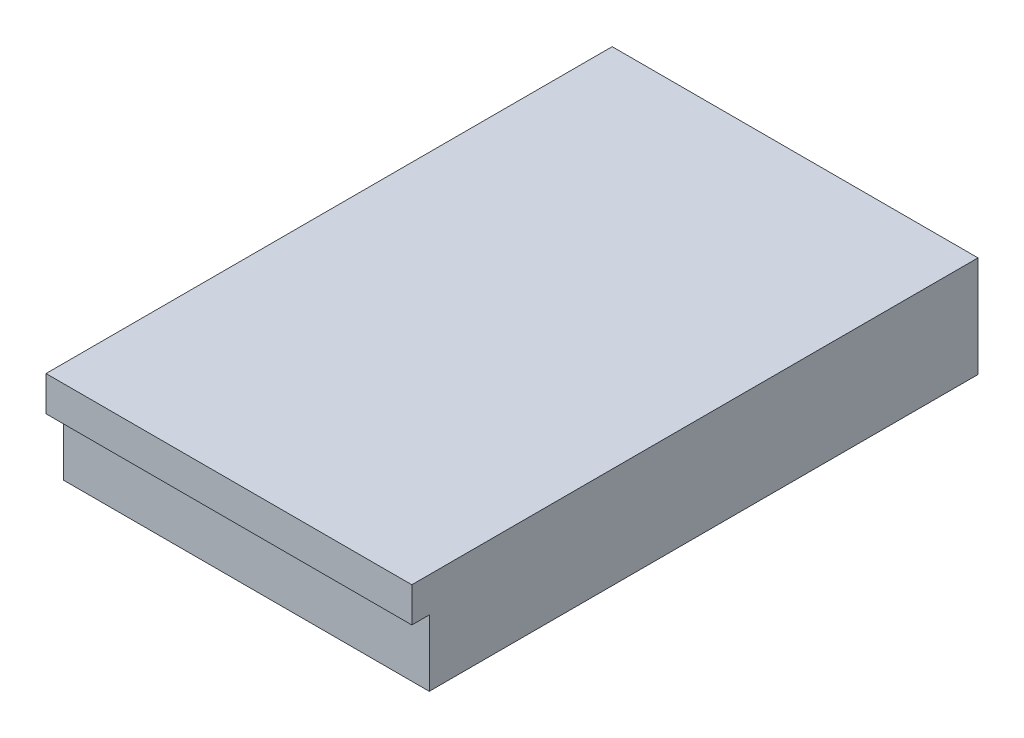
ISO-10303-21;
HEADER;
FILE_DESCRIPTION(('STEP AP214'),'2;1');
FILE_NAME('part.step','',(''),(''),'','','');
FILE_SCHEMA(('AUTOMOTIVE_DESIGN { 1 0 10303 214 1 1 1 1 }'));
ENDSEC;
DATA;
#1=APPLICATION_CONTEXT('core data for automotive mechanical design processes');
#2=APPLICATION_PROTOCOL_DEFINITION('international standard','automotive_design',2000,#1);
#3=PRODUCT_CONTEXT('',#1,'mechanical');
#4=PRODUCT('Part','Part','',(#3));
#5=PRODUCT_RELATED_PRODUCT_CATEGORY('part','',(#4));
#6=PRODUCT_DEFINITION_FORMATION('','',#4);
#7=PRODUCT_DEFINITION_CONTEXT('part definition',#1,'design');
#8=PRODUCT_DEFINITION('design','',#6,#7);
#9=PRODUCT_DEFINITION_SHAPE('','',#8);
#10=(LENGTH_UNIT() NAMED_UNIT(*) SI_UNIT(.MILLI.,.METRE.));
#11=(NAMED_UNIT(*) PLANE_ANGLE_UNIT() SI_UNIT($,.RADIAN.));
#12=(NAMED_UNIT(*) SI_UNIT($,.STERADIAN.) SOLID_ANGLE_UNIT());
#13=UNCERTAINTY_MEASURE_WITH_UNIT(LENGTH_MEASURE(1.E-05),#10,'distance_accuracy_value','');
#14=(GEOMETRIC_REPRESENTATION_CONTEXT(3) GLOBAL_UNCERTAINTY_ASSIGNED_CONTEXT((#13)) GLOBAL_UNIT_ASSIGNED_CONTEXT((#10,
#11,#12)) REPRESENTATION_CONTEXT('',''));
#15=CARTESIAN_POINT('',(0.,0.,0.));
#16=DIRECTION('',(0.,0.,1.));
#17=DIRECTION('',(1.,0.,0.));
#18=AXIS2_PLACEMENT_3D('',#15,#16,#17);
#19=CARTESIAN_POINT('',(26.67,14.732,40.005));
#20=DIRECTION('',(0.,0.,-1.));
#21=DIRECTION('',(-1.,0.,0.));
#22=AXIS2_PLACEMENT_3D('',#19,#20,#21);
#23=PLANE('',#22);
#24=DIRECTION('',(1.,0.,0.));
#25=VECTOR('',#24,1.);
#26=CARTESIAN_POINT('',(-26.67,9.652,40.005));
#27=LINE('',#26,#25);
#28=CARTESIAN_POINT('',(-26.67,9.652,40.005));
#29=VERTEX_POINT('',#28);
#30=CARTESIAN_POINT('',(26.67,9.652,40.005));
#31=VERTEX_POINT('',#30);
#32=EDGE_CURVE('E51',#29,#31,#27,.T.);
#33=ORIENTED_EDGE('',*,*,#32,.F.);
#34=DIRECTION('',(0.,-1.,0.));
#35=VECTOR('',#34,1.);
#36=CARTESIAN_POINT('',(-26.67,14.732,40.005));
#37=LINE('',#36,#35);
#38=CARTESIAN_POINT('',(-26.67,0.,40.005));
#39=VERTEX_POINT('',#38);
#40=EDGE_CURVE('E11',#29,#39,#37,.T.);
#41=ORIENTED_EDGE('',*,*,#40,.T.);
#42=DIRECTION('',(1.,0.,0.));
#43=VECTOR('',#42,1.);
#44=CARTESIAN_POINT('',(26.67,0.,40.005));
#45=LINE('',#44,#43);
#46=CARTESIAN_POINT('',(26.67,0.,40.005));
#47=VERTEX_POINT('',#46);
#48=EDGE_CURVE('E99',#39,#47,#45,.T.);
#49=ORIENTED_EDGE('',*,*,#48,.T.);
#50=DIRECTION('',(0.,-1.,0.));
#51=VECTOR('',#50,1.);
#52=CARTESIAN_POINT('',(26.67,14.732,40.005));
#53=LINE('',#52,#51);
#54=EDGE_CURVE('E44',#31,#47,#53,.T.);
#55=ORIENTED_EDGE('',*,*,#54,.F.);
#56=EDGE_LOOP('',(#33,#41,#49,#55));
#57=FACE_BOUND('',#56,.T.);
#58=ADVANCED_FACE('F35',(#57),#23,.F.);
#59=CARTESIAN_POINT('',(-26.67,14.732,-40.005));
#60=DIRECTION('',(1.,0.,0.));
#61=DIRECTION('',(0.,0.,-1.));
#62=AXIS2_PLACEMENT_3D('',#59,#60,#61);
#63=PLANE('',#62);
#64=DIRECTION('',(0.,0.,1.));
#65=VECTOR('',#64,1.);
#66=CARTESIAN_POINT('',(-26.67,0.,-40.005));
#67=LINE('',#66,#65);
#68=CARTESIAN_POINT('',(-26.67,0.,-40.005));
#69=VERTEX_POINT('',#68);
#70=EDGE_CURVE('E93',#69,#39,#67,.T.);
#71=ORIENTED_EDGE('',*,*,#70,.T.);
#72=ORIENTED_EDGE('',*,*,#40,.F.);
#73=DIRECTION('',(0.,0.,-1.));
#74=VECTOR('',#73,1.);
#75=CARTESIAN_POINT('',(-26.67,9.652,42.545));
#76=LINE('',#75,#74);
#77=CARTESIAN_POINT('',(-26.67,9.652,42.545));
#78=VERTEX_POINT('',#77);
#79=EDGE_CURVE('E100',#78,#29,#76,.T.);
#80=ORIENTED_EDGE('',*,*,#79,.F.);
#81=DIRECTION('',(0.,-1.,0.));
#82=VECTOR('',#81,1.);
#83=CARTESIAN_POINT('',(-26.67,14.732,42.545));
#84=LINE('',#83,#82);
#85=CARTESIAN_POINT('',(-26.67,14.732,42.545));
#86=VERTEX_POINT('',#85);
#87=EDGE_CURVE('E117',#86,#78,#84,.T.);
#88=ORIENTED_EDGE('',*,*,#87,.F.);
#89=DIRECTION('',(0.,0.,1.));
#90=VECTOR('',#89,1.);
#91=CARTESIAN_POINT('',(-26.67,14.732,-40.005));
#92=LINE('',#91,#90);
#93=CARTESIAN_POINT('',(-26.67,14.732,-40.005));
#94=VERTEX_POINT('',#93);
#95=EDGE_CURVE('E88',#94,#86,#92,.T.);
#96=ORIENTED_EDGE('',*,*,#95,.F.);
#97=DIRECTION('',(0.,-1.,0.));
#98=VECTOR('',#97,1.);
#99=CARTESIAN_POINT('',(-26.67,14.732,-40.005));
#100=LINE('',#99,#98);
#101=EDGE_CURVE('E81',#94,#69,#100,.T.);
#102=ORIENTED_EDGE('',*,*,#101,.T.);
#103=EDGE_LOOP('',(#71,#72,#80,#88,#96,#102));
#104=FACE_BOUND('',#103,.T.);
#105=ADVANCED_FACE('F37',(#104),#63,.F.);
#106=CARTESIAN_POINT('',(26.67,14.732,-40.005));
#107=DIRECTION('',(-1.,0.,0.));
#108=DIRECTION('',(0.,0.,1.));
#109=AXIS2_PLACEMENT_3D('',#106,#107,#108);
#110=PLANE('',#109);
#111=DIRECTION('',(0.,0.,-1.));
#112=VECTOR('',#111,1.);
#113=CARTESIAN_POINT('',(26.67,0.,-40.005));
#114=LINE('',#113,#112);
#115=CARTESIAN_POINT('',(26.67,0.,-40.005));
#116=VERTEX_POINT('',#115);
#117=EDGE_CURVE('E89',#47,#116,#114,.T.);
#118=ORIENTED_EDGE('',*,*,#117,.T.);
#119=DIRECTION('',(0.,-1.,0.));
#120=VECTOR('',#119,1.);
#121=CARTESIAN_POINT('',(26.67,14.732,-40.005));
#122=LINE('',#121,#120);
#123=CARTESIAN_POINT('',(26.67,14.732,-40.005));
#124=VERTEX_POINT('',#123);
#125=EDGE_CURVE('E84',#124,#116,#122,.T.);
#126=ORIENTED_EDGE('',*,*,#125,.F.);
#127=DIRECTION('',(0.,0.,-1.));
#128=VECTOR('',#127,1.);
#129=CARTESIAN_POINT('',(26.67,14.732,-40.005));
#130=LINE('',#129,#128);
#131=CARTESIAN_POINT('',(26.67,14.732,42.545));
#132=VERTEX_POINT('',#131);
#133=EDGE_CURVE('E124',#132,#124,#130,.T.);
#134=ORIENTED_EDGE('',*,*,#133,.F.);
#135=DIRECTION('',(0.,1.,0.));
#136=VECTOR('',#135,1.);
#137=CARTESIAN_POINT('',(26.67,14.732,42.545));
#138=LINE('',#137,#136);
#139=CARTESIAN_POINT('',(26.67,9.652,42.545));
#140=VERTEX_POINT('',#139);
#141=EDGE_CURVE('E148',#140,#132,#138,.T.);
#142=ORIENTED_EDGE('',*,*,#141,.F.);
#143=DIRECTION('',(0.,0.,-1.));
#144=VECTOR('',#143,1.);
#145=CARTESIAN_POINT('',(26.67,9.652,42.545));
#146=LINE('',#145,#144);
#147=EDGE_CURVE('E104',#140,#31,#146,.T.);
#148=ORIENTED_EDGE('',*,*,#147,.T.);
#149=ORIENTED_EDGE('',*,*,#54,.T.);
#150=EDGE_LOOP('',(#118,#126,#134,#142,#148,#149));
#151=FACE_BOUND('',#150,.T.);
#152=ADVANCED_FACE('F133',(#151),#110,.F.);
#153=CARTESIAN_POINT('',(26.67,14.732,-40.005));
#154=DIRECTION('',(0.,0.,1.));
#155=DIRECTION('',(1.,0.,0.));
#156=AXIS2_PLACEMENT_3D('',#153,#154,#155);
#157=PLANE('',#156);
#158=DIRECTION('',(-1.,0.,0.));
#159=VECTOR('',#158,1.);
#160=CARTESIAN_POINT('',(26.67,0.,-40.005));
#161=LINE('',#160,#159);
#162=EDGE_CURVE('E78',#116,#69,#161,.T.);
#163=ORIENTED_EDGE('',*,*,#162,.T.);
#164=ORIENTED_EDGE('',*,*,#101,.F.);
#165=DIRECTION('',(-1.,0.,0.));
#166=VECTOR('',#165,1.);
#167=CARTESIAN_POINT('',(26.67,14.732,-40.005));
#168=LINE('',#167,#166);
#169=EDGE_CURVE('E60',#124,#94,#168,.T.);
#170=ORIENTED_EDGE('',*,*,#169,.F.);
#171=ORIENTED_EDGE('',*,*,#125,.T.);
#172=EDGE_LOOP('',(#163,#164,#170,#171));
#173=FACE_BOUND('',#172,.T.);
#174=ADVANCED_FACE('F80',(#173),#157,.F.);
#175=CARTESIAN_POINT('',(-26.67,14.732,40.005));
#176=DIRECTION('',(0.,-1.,0.));
#177=DIRECTION('',(0.,0.,-1.));
#178=AXIS2_PLACEMENT_3D('',#175,#176,#177);
#179=PLANE('',#178);
#180=ORIENTED_EDGE('',*,*,#95,.T.);
#181=DIRECTION('',(-1.,0.,0.));
#182=VECTOR('',#181,1.);
#183=CARTESIAN_POINT('',(-26.67,14.732,42.545));
#184=LINE('',#183,#182);
#185=EDGE_CURVE('E122',#132,#86,#184,.T.);
#186=ORIENTED_EDGE('',*,*,#185,.F.);
#187=ORIENTED_EDGE('',*,*,#133,.T.);
#188=ORIENTED_EDGE('',*,*,#169,.T.);
#189=EDGE_LOOP('',(#180,#186,#187,#188));
#190=FACE_BOUND('',#189,.T.);
#191=ADVANCED_FACE('F127',(#190),#179,.F.);
#192=CARTESIAN_POINT('',(-26.67,0.,40.005));
#193=DIRECTION('',(0.,-1.,0.));
#194=DIRECTION('',(0.,0.,-1.));
#195=AXIS2_PLACEMENT_3D('',#192,#193,#194);
#196=PLANE('',#195);
#197=ORIENTED_EDGE('',*,*,#70,.F.);
#198=ORIENTED_EDGE('',*,*,#162,.F.);
#199=ORIENTED_EDGE('',*,*,#117,.F.);
#200=ORIENTED_EDGE('',*,*,#48,.F.);
#201=EDGE_LOOP('',(#197,#198,#199,#200));
#202=FACE_BOUND('',#201,.T.);
#203=ADVANCED_FACE('F97',(#202),#196,.T.);
#204=CARTESIAN_POINT('',(-26.67,9.652,42.545));
#205=DIRECTION('',(0.,1.,0.));
#206=DIRECTION('',(-1.,0.,0.));
#207=AXIS2_PLACEMENT_3D('',#204,#205,#206);
#208=PLANE('',#207);
#209=ORIENTED_EDGE('',*,*,#32,.T.);
#210=ORIENTED_EDGE('',*,*,#147,.F.);
#211=DIRECTION('',(1.,0.,0.));
#212=VECTOR('',#211,1.);
#213=CARTESIAN_POINT('',(-26.67,9.652,42.545));
#214=LINE('',#213,#212);
#215=EDGE_CURVE('E143',#78,#140,#214,.T.);
#216=ORIENTED_EDGE('',*,*,#215,.F.);
#217=ORIENTED_EDGE('',*,*,#79,.T.);
#218=EDGE_LOOP('',(#209,#210,#216,#217));
#219=FACE_BOUND('',#218,.T.);
#220=ADVANCED_FACE('F141',(#219),#208,.F.);
#221=CARTESIAN_POINT('',(-26.67,9.652,42.545));
#222=DIRECTION('',(0.,0.,1.));
#223=DIRECTION('',(1.,0.,0.));
#224=AXIS2_PLACEMENT_3D('',#221,#222,#223);
#225=PLANE('',#224);
#226=ORIENTED_EDGE('',*,*,#87,.T.);
#227=ORIENTED_EDGE('',*,*,#215,.T.);
#228=ORIENTED_EDGE('',*,*,#141,.T.);
#229=ORIENTED_EDGE('',*,*,#185,.T.);
#230=EDGE_LOOP('',(#226,#227,#228,#229));
#231=FACE_BOUND('',#230,.T.);
#232=ADVANCED_FACE('F150',(#231),#225,.T.);
#233=CLOSED_SHELL('',(#58,#105,#152,#174,#191,#203,#220,#232));
#234=MANIFOLD_SOLID_BREP('B2',#233);
#235=ADVANCED_BREP_SHAPE_REPRESENTATION('',(#18,#234),#14);
#236=SHAPE_DEFINITION_REPRESENTATION(#9,#235);
ENDSEC;
END-ISO-10303-21;
